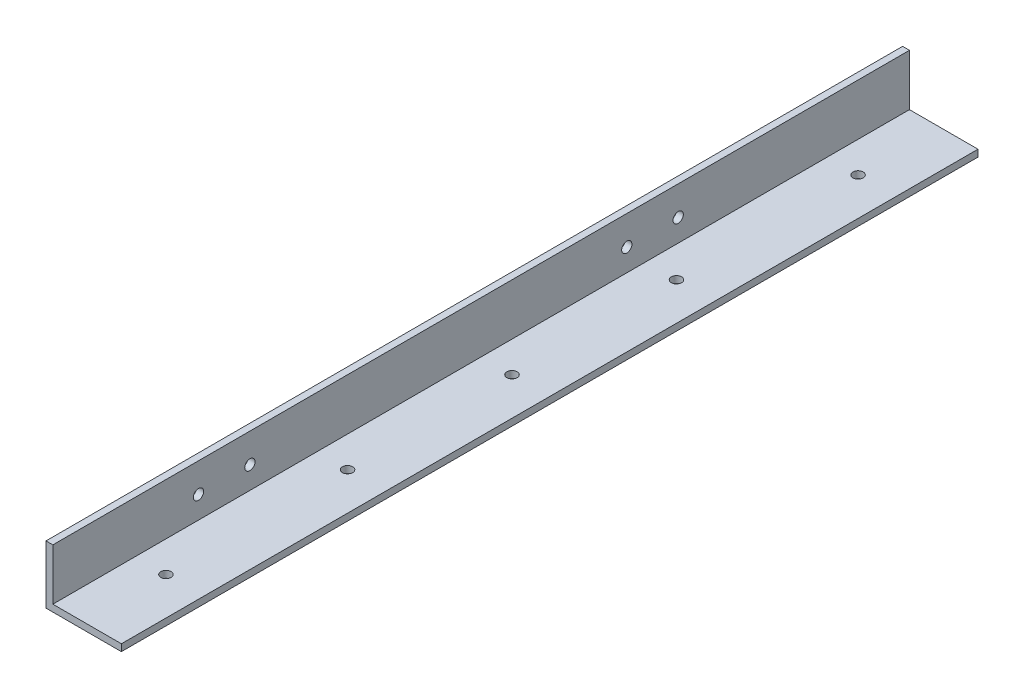
ISO-10303-21;
HEADER;
FILE_DESCRIPTION(('STEP AP214'),'2;1');
FILE_NAME('part.step','',(''),(''),'','','');
FILE_SCHEMA(('AUTOMOTIVE_DESIGN { 1 0 10303 214 1 1 1 1 }'));
ENDSEC;
DATA;
#1=APPLICATION_CONTEXT('core data for automotive mechanical design processes');
#2=APPLICATION_PROTOCOL_DEFINITION('international standard','automotive_design',2000,#1);
#3=PRODUCT_CONTEXT('',#1,'mechanical');
#4=PRODUCT('Part','Part','',(#3));
#5=PRODUCT_RELATED_PRODUCT_CATEGORY('part','',(#4));
#6=PRODUCT_DEFINITION_FORMATION('','',#4);
#7=PRODUCT_DEFINITION_CONTEXT('part definition',#1,'design');
#8=PRODUCT_DEFINITION('design','',#6,#7);
#9=PRODUCT_DEFINITION_SHAPE('','',#8);
#10=(LENGTH_UNIT() NAMED_UNIT(*) SI_UNIT(.MILLI.,.METRE.));
#11=(NAMED_UNIT(*) PLANE_ANGLE_UNIT() SI_UNIT($,.RADIAN.));
#12=(NAMED_UNIT(*) SI_UNIT($,.STERADIAN.) SOLID_ANGLE_UNIT());
#13=UNCERTAINTY_MEASURE_WITH_UNIT(LENGTH_MEASURE(1.E-05),#10,'distance_accuracy_value','');
#14=(GEOMETRIC_REPRESENTATION_CONTEXT(3) GLOBAL_UNCERTAINTY_ASSIGNED_CONTEXT((#13)) GLOBAL_UNIT_ASSIGNED_CONTEXT((#10,
#11,#12)) REPRESENTATION_CONTEXT('',''));
#15=CARTESIAN_POINT('',(0.,0.,0.));
#16=DIRECTION('',(0.,0.,1.));
#17=DIRECTION('',(1.,0.,0.));
#18=AXIS2_PLACEMENT_3D('',#15,#16,#17);
#19=CARTESIAN_POINT('',(0.,0.,-250.));
#20=DIRECTION('',(0.,-1.,0.));
#21=DIRECTION('',(0.,0.,-1.));
#22=AXIS2_PLACEMENT_3D('',#19,#20,#21);
#23=PLANE('',#22);
#24=CARTESIAN_POINT('',(11.,0.,-226.));
#25=DIRECTION('',(0.,-1.,0.));
#26=DIRECTION('',(0.,0.,-1.));
#27=AXIS2_PLACEMENT_3D('',#24,#25,#26);
#28=CIRCLE('',#27,1.5);
#29=CARTESIAN_POINT('',(11.,0.,-227.5));
#30=VERTEX_POINT('',#29);
#31=EDGE_CURVE('E131',#30,#30,#28,.T.);
#32=ORIENTED_EDGE('',*,*,#31,.F.);
#33=EDGE_LOOP('',(#32));
#34=FACE_BOUND('',#33,.T.);
#35=CARTESIAN_POINT('',(11.,0.,-77.));
#36=DIRECTION('',(0.,-1.,0.));
#37=DIRECTION('',(0.,0.,-1.));
#38=AXIS2_PLACEMENT_3D('',#35,#36,#37);
#39=CIRCLE('',#38,1.5);
#40=CARTESIAN_POINT('',(11.,0.,-78.5));
#41=VERTEX_POINT('',#40);
#42=EDGE_CURVE('E188',#41,#41,#39,.T.);
#43=ORIENTED_EDGE('',*,*,#42,.F.);
#44=EDGE_LOOP('',(#43));
#45=FACE_BOUND('',#44,.T.);
#46=CARTESIAN_POINT('',(11.,0.,-173.));
#47=DIRECTION('',(0.,-1.,0.));
#48=DIRECTION('',(0.,0.,-1.));
#49=AXIS2_PLACEMENT_3D('',#46,#47,#48);
#50=CIRCLE('',#49,1.5);
#51=CARTESIAN_POINT('',(11.,0.,-174.5));
#52=VERTEX_POINT('',#51);
#53=EDGE_CURVE('E185',#52,#52,#50,.T.);
#54=ORIENTED_EDGE('',*,*,#53,.F.);
#55=EDGE_LOOP('',(#54));
#56=FACE_BOUND('',#55,.T.);
#57=CARTESIAN_POINT('',(11.,0.,-125.));
#58=DIRECTION('',(0.,-1.,0.));
#59=DIRECTION('',(0.,0.,-1.));
#60=AXIS2_PLACEMENT_3D('',#57,#58,#59);
#61=CIRCLE('',#60,1.5);
#62=CARTESIAN_POINT('',(11.,0.,-126.5));
#63=VERTEX_POINT('',#62);
#64=EDGE_CURVE('E182',#63,#63,#61,.T.);
#65=ORIENTED_EDGE('',*,*,#64,.F.);
#66=EDGE_LOOP('',(#65));
#67=FACE_BOUND('',#66,.T.);
#68=CARTESIAN_POINT('',(11.,0.,-24.));
#69=DIRECTION('',(0.,-1.,0.));
#70=DIRECTION('',(0.,0.,-1.));
#71=AXIS2_PLACEMENT_3D('',#68,#69,#70);
#72=CIRCLE('',#71,1.5);
#73=CARTESIAN_POINT('',(11.,0.,-25.5));
#74=VERTEX_POINT('',#73);
#75=EDGE_CURVE('E179',#74,#74,#72,.T.);
#76=ORIENTED_EDGE('',*,*,#75,.F.);
#77=EDGE_LOOP('',(#76));
#78=FACE_BOUND('',#77,.T.);
#79=DIRECTION('',(1.,0.,0.));
#80=VECTOR('',#79,1.);
#81=CARTESIAN_POINT('',(0.,0.,0.));
#82=LINE('',#81,#80);
#83=CARTESIAN_POINT('',(0.,0.,0.));
#84=VERTEX_POINT('',#83);
#85=CARTESIAN_POINT('',(22.,0.,0.));
#86=VERTEX_POINT('',#85);
#87=EDGE_CURVE('E127',#84,#86,#82,.T.);
#88=ORIENTED_EDGE('',*,*,#87,.F.);
#89=DIRECTION('',(0.,0.,1.));
#90=VECTOR('',#89,1.);
#91=CARTESIAN_POINT('',(0.,0.,-250.));
#92=LINE('',#91,#90);
#93=CARTESIAN_POINT('',(0.,0.,-250.));
#94=VERTEX_POINT('',#93);
#95=EDGE_CURVE('E11',#94,#84,#92,.T.);
#96=ORIENTED_EDGE('',*,*,#95,.F.);
#97=DIRECTION('',(1.,0.,0.));
#98=VECTOR('',#97,1.);
#99=CARTESIAN_POINT('',(0.,0.,-250.));
#100=LINE('',#99,#98);
#101=CARTESIAN_POINT('',(22.,0.,-250.));
#102=VERTEX_POINT('',#101);
#103=EDGE_CURVE('E142',#94,#102,#100,.T.);
#104=ORIENTED_EDGE('',*,*,#103,.T.);
#105=DIRECTION('',(0.,0.,1.));
#106=VECTOR('',#105,1.);
#107=CARTESIAN_POINT('',(22.,0.,-250.));
#108=LINE('',#107,#106);
#109=EDGE_CURVE('E91',#102,#86,#108,.T.);
#110=ORIENTED_EDGE('',*,*,#109,.T.);
#111=EDGE_LOOP('',(#88,#96,#104,#110));
#112=FACE_BOUND('',#111,.T.);
#113=ADVANCED_FACE('F41',(#34,#45,#56,#67,#78,#112),#23,.T.);
#114=CARTESIAN_POINT('',(0.,0.,-250.));
#115=DIRECTION('',(-1.,0.,0.));
#116=DIRECTION('',(0.,0.,1.));
#117=AXIS2_PLACEMENT_3D('',#114,#115,#116);
#118=PLANE('',#117);
#119=CARTESIAN_POINT('',(0.,8.5,-182.5));
#120=DIRECTION('',(-1.,0.,0.));
#121=DIRECTION('',(0.,0.,1.));
#122=AXIS2_PLACEMENT_3D('',#119,#120,#121);
#123=CIRCLE('',#122,1.5);
#124=CARTESIAN_POINT('',(0.,8.5,-181.));
#125=VERTEX_POINT('',#124);
#126=EDGE_CURVE('E153',#125,#125,#123,.T.);
#127=ORIENTED_EDGE('',*,*,#126,.F.);
#128=EDGE_LOOP('',(#127));
#129=FACE_BOUND('',#128,.T.);
#130=CARTESIAN_POINT('',(0.,8.5,-57.5));
#131=DIRECTION('',(-1.,0.,0.));
#132=DIRECTION('',(0.,0.,1.));
#133=AXIS2_PLACEMENT_3D('',#130,#131,#132);
#134=CIRCLE('',#133,1.5);
#135=CARTESIAN_POINT('',(0.,8.5,-56.));
#136=VERTEX_POINT('',#135);
#137=EDGE_CURVE('E269',#136,#136,#134,.T.);
#138=ORIENTED_EDGE('',*,*,#137,.F.);
#139=EDGE_LOOP('',(#138));
#140=FACE_BOUND('',#139,.T.);
#141=CARTESIAN_POINT('',(0.,8.5,-42.5));
#142=DIRECTION('',(-1.,0.,0.));
#143=DIRECTION('',(0.,0.,1.));
#144=AXIS2_PLACEMENT_3D('',#141,#142,#143);
#145=CIRCLE('',#144,1.5);
#146=CARTESIAN_POINT('',(0.,8.5,-41.));
#147=VERTEX_POINT('',#146);
#148=EDGE_CURVE('E266',#147,#147,#145,.T.);
#149=ORIENTED_EDGE('',*,*,#148,.F.);
#150=EDGE_LOOP('',(#149));
#151=FACE_BOUND('',#150,.T.);
#152=CARTESIAN_POINT('',(0.,8.5,-167.5));
#153=DIRECTION('',(-1.,0.,0.));
#154=DIRECTION('',(0.,0.,1.));
#155=AXIS2_PLACEMENT_3D('',#152,#153,#154);
#156=CIRCLE('',#155,1.5);
#157=CARTESIAN_POINT('',(0.,8.5,-166.));
#158=VERTEX_POINT('',#157);
#159=EDGE_CURVE('E263',#158,#158,#156,.T.);
#160=ORIENTED_EDGE('',*,*,#159,.F.);
#161=EDGE_LOOP('',(#160));
#162=FACE_BOUND('',#161,.T.);
#163=DIRECTION('',(0.,-1.,0.));
#164=VECTOR('',#163,1.);
#165=CARTESIAN_POINT('',(0.,0.,0.));
#166=LINE('',#165,#164);
#167=CARTESIAN_POINT('',(0.,17.,0.));
#168=VERTEX_POINT('',#167);
#169=EDGE_CURVE('E140',#168,#84,#166,.T.);
#170=ORIENTED_EDGE('',*,*,#169,.F.);
#171=DIRECTION('',(0.,0.,1.));
#172=VECTOR('',#171,1.);
#173=CARTESIAN_POINT('',(0.,17.,-250.));
#174=LINE('',#173,#172);
#175=CARTESIAN_POINT('',(0.,17.,-250.));
#176=VERTEX_POINT('',#175);
#177=EDGE_CURVE('E50',#176,#168,#174,.T.);
#178=ORIENTED_EDGE('',*,*,#177,.F.);
#179=DIRECTION('',(0.,-1.,0.));
#180=VECTOR('',#179,1.);
#181=CARTESIAN_POINT('',(0.,0.,-250.));
#182=LINE('',#181,#180);
#183=EDGE_CURVE('E117',#176,#94,#182,.T.);
#184=ORIENTED_EDGE('',*,*,#183,.T.);
#185=ORIENTED_EDGE('',*,*,#95,.T.);
#186=EDGE_LOOP('',(#170,#178,#184,#185));
#187=FACE_BOUND('',#186,.T.);
#188=ADVANCED_FACE('F197',(#129,#140,#151,#162,#187),#118,.T.);
#189=CARTESIAN_POINT('',(0.,17.,-250.));
#190=DIRECTION('',(0.,1.,0.));
#191=DIRECTION('',(0.,0.,1.));
#192=AXIS2_PLACEMENT_3D('',#189,#190,#191);
#193=PLANE('',#192);
#194=DIRECTION('',(-1.,0.,0.));
#195=VECTOR('',#194,1.);
#196=CARTESIAN_POINT('',(0.,17.,0.));
#197=LINE('',#196,#195);
#198=CARTESIAN_POINT('',(2.,17.,0.));
#199=VERTEX_POINT('',#198);
#200=EDGE_CURVE('E104',#199,#168,#197,.T.);
#201=ORIENTED_EDGE('',*,*,#200,.F.);
#202=DIRECTION('',(0.,0.,1.));
#203=VECTOR('',#202,1.);
#204=CARTESIAN_POINT('',(2.,17.,-250.));
#205=LINE('',#204,#203);
#206=CARTESIAN_POINT('',(2.,17.,-250.));
#207=VERTEX_POINT('',#206);
#208=EDGE_CURVE('E99',#207,#199,#205,.T.);
#209=ORIENTED_EDGE('',*,*,#208,.F.);
#210=DIRECTION('',(-1.,0.,0.));
#211=VECTOR('',#210,1.);
#212=CARTESIAN_POINT('',(0.,17.,-250.));
#213=LINE('',#212,#211);
#214=EDGE_CURVE('E102',#207,#176,#213,.T.);
#215=ORIENTED_EDGE('',*,*,#214,.T.);
#216=ORIENTED_EDGE('',*,*,#177,.T.);
#217=EDGE_LOOP('',(#201,#209,#215,#216));
#218=FACE_BOUND('',#217,.T.);
#219=ADVANCED_FACE('F101',(#218),#193,.T.);
#220=CARTESIAN_POINT('',(2.,17.,-250.));
#221=DIRECTION('',(1.,0.,0.));
#222=DIRECTION('',(0.,1.,0.));
#223=AXIS2_PLACEMENT_3D('',#220,#221,#222);
#224=PLANE('',#223);
#225=CARTESIAN_POINT('',(2.,8.5,-182.5));
#226=DIRECTION('',(1.,0.,0.));
#227=DIRECTION('',(0.,1.,0.));
#228=AXIS2_PLACEMENT_3D('',#225,#226,#227);
#229=CIRCLE('',#228,1.5);
#230=CARTESIAN_POINT('',(2.,10.,-182.5));
#231=VERTEX_POINT('',#230);
#232=EDGE_CURVE('E44',#231,#231,#229,.T.);
#233=ORIENTED_EDGE('',*,*,#232,.F.);
#234=EDGE_LOOP('',(#233));
#235=FACE_BOUND('',#234,.T.);
#236=CARTESIAN_POINT('',(2.,8.5,-57.5));
#237=DIRECTION('',(1.,0.,0.));
#238=DIRECTION('',(0.,1.,0.));
#239=AXIS2_PLACEMENT_3D('',#236,#237,#238);
#240=CIRCLE('',#239,1.5);
#241=CARTESIAN_POINT('',(2.,9.99999999999999,-57.5));
#242=VERTEX_POINT('',#241);
#243=EDGE_CURVE('E155',#242,#242,#240,.T.);
#244=ORIENTED_EDGE('',*,*,#243,.F.);
#245=EDGE_LOOP('',(#244));
#246=FACE_BOUND('',#245,.T.);
#247=CARTESIAN_POINT('',(2.,8.5,-42.5));
#248=DIRECTION('',(1.,0.,0.));
#249=DIRECTION('',(0.,1.,0.));
#250=AXIS2_PLACEMENT_3D('',#247,#248,#249);
#251=CIRCLE('',#250,1.5);
#252=CARTESIAN_POINT('',(2.,10.,-42.5));
#253=VERTEX_POINT('',#252);
#254=EDGE_CURVE('E152',#253,#253,#251,.T.);
#255=ORIENTED_EDGE('',*,*,#254,.F.);
#256=EDGE_LOOP('',(#255));
#257=FACE_BOUND('',#256,.T.);
#258=CARTESIAN_POINT('',(2.,8.5,-167.5));
#259=DIRECTION('',(1.,0.,0.));
#260=DIRECTION('',(0.,1.,0.));
#261=AXIS2_PLACEMENT_3D('',#258,#259,#260);
#262=CIRCLE('',#261,1.5);
#263=CARTESIAN_POINT('',(2.,10.,-167.5));
#264=VERTEX_POINT('',#263);
#265=EDGE_CURVE('E149',#264,#264,#262,.T.);
#266=ORIENTED_EDGE('',*,*,#265,.F.);
#267=EDGE_LOOP('',(#266));
#268=FACE_BOUND('',#267,.T.);
#269=DIRECTION('',(0.,1.,0.));
#270=VECTOR('',#269,1.);
#271=CARTESIAN_POINT('',(2.,17.,0.));
#272=LINE('',#271,#270);
#273=CARTESIAN_POINT('',(2.,2.,0.));
#274=VERTEX_POINT('',#273);
#275=EDGE_CURVE('E137',#274,#199,#272,.T.);
#276=ORIENTED_EDGE('',*,*,#275,.F.);
#277=DIRECTION('',(0.,0.,1.));
#278=VECTOR('',#277,1.);
#279=CARTESIAN_POINT('',(2.,2.,-250.));
#280=LINE('',#279,#278);
#281=CARTESIAN_POINT('',(2.,2.,-250.));
#282=VERTEX_POINT('',#281);
#283=EDGE_CURVE('E109',#282,#274,#280,.T.);
#284=ORIENTED_EDGE('',*,*,#283,.F.);
#285=DIRECTION('',(0.,1.,0.));
#286=VECTOR('',#285,1.);
#287=CARTESIAN_POINT('',(2.,17.,-250.));
#288=LINE('',#287,#286);
#289=EDGE_CURVE('E115',#282,#207,#288,.T.);
#290=ORIENTED_EDGE('',*,*,#289,.T.);
#291=ORIENTED_EDGE('',*,*,#208,.T.);
#292=EDGE_LOOP('',(#276,#284,#290,#291));
#293=FACE_BOUND('',#292,.T.);
#294=ADVANCED_FACE('F119',(#235,#246,#257,#268,#293),#224,.T.);
#295=CARTESIAN_POINT('',(2.,2.,-250.));
#296=DIRECTION('',(0.,1.,0.));
#297=DIRECTION('',(0.,0.,1.));
#298=AXIS2_PLACEMENT_3D('',#295,#296,#297);
#299=PLANE('',#298);
#300=CARTESIAN_POINT('',(11.,2.,-226.));
#301=DIRECTION('',(0.,1.,0.));
#302=DIRECTION('',(0.,0.,1.));
#303=AXIS2_PLACEMENT_3D('',#300,#301,#302);
#304=CIRCLE('',#303,1.5);
#305=CARTESIAN_POINT('',(11.,2.,-224.5));
#306=VERTEX_POINT('',#305);
#307=EDGE_CURVE('E176',#306,#306,#304,.T.);
#308=ORIENTED_EDGE('',*,*,#307,.F.);
#309=EDGE_LOOP('',(#308));
#310=FACE_BOUND('',#309,.T.);
#311=CARTESIAN_POINT('',(11.,2.,-77.));
#312=DIRECTION('',(0.,1.,0.));
#313=DIRECTION('',(0.,0.,1.));
#314=AXIS2_PLACEMENT_3D('',#311,#312,#313);
#315=CIRCLE('',#314,1.5);
#316=CARTESIAN_POINT('',(11.,2.,-75.5));
#317=VERTEX_POINT('',#316);
#318=EDGE_CURVE('E160',#317,#317,#315,.T.);
#319=ORIENTED_EDGE('',*,*,#318,.F.);
#320=EDGE_LOOP('',(#319));
#321=FACE_BOUND('',#320,.T.);
#322=CARTESIAN_POINT('',(11.,2.,-173.));
#323=DIRECTION('',(0.,1.,0.));
#324=DIRECTION('',(0.,0.,1.));
#325=AXIS2_PLACEMENT_3D('',#322,#323,#324);
#326=CIRCLE('',#325,1.5);
#327=CARTESIAN_POINT('',(11.,2.,-171.5));
#328=VERTEX_POINT('',#327);
#329=EDGE_CURVE('E164',#328,#328,#326,.T.);
#330=ORIENTED_EDGE('',*,*,#329,.F.);
#331=EDGE_LOOP('',(#330));
#332=FACE_BOUND('',#331,.T.);
#333=CARTESIAN_POINT('',(11.,2.,-125.));
#334=DIRECTION('',(0.,1.,0.));
#335=DIRECTION('',(0.,0.,1.));
#336=AXIS2_PLACEMENT_3D('',#333,#334,#335);
#337=CIRCLE('',#336,1.5);
#338=CARTESIAN_POINT('',(11.,2.,-123.5));
#339=VERTEX_POINT('',#338);
#340=EDGE_CURVE('E169',#339,#339,#337,.T.);
#341=ORIENTED_EDGE('',*,*,#340,.F.);
#342=EDGE_LOOP('',(#341));
#343=FACE_BOUND('',#342,.T.);
#344=CARTESIAN_POINT('',(11.,2.,-24.));
#345=DIRECTION('',(0.,1.,0.));
#346=DIRECTION('',(0.,0.,-1.));
#347=AXIS2_PLACEMENT_3D('',#344,#345,#346);
#348=CIRCLE('',#347,1.5);
#349=CARTESIAN_POINT('',(11.,2.,-25.5));
#350=VERTEX_POINT('',#349);
#351=EDGE_CURVE('E173',#350,#350,#348,.T.);
#352=ORIENTED_EDGE('',*,*,#351,.F.);
#353=EDGE_LOOP('',(#352));
#354=FACE_BOUND('',#353,.T.);
#355=DIRECTION('',(-1.,0.,0.));
#356=VECTOR('',#355,1.);
#357=CARTESIAN_POINT('',(2.,2.,0.));
#358=LINE('',#357,#356);
#359=CARTESIAN_POINT('',(22.,2.,0.));
#360=VERTEX_POINT('',#359);
#361=EDGE_CURVE('E134',#360,#274,#358,.T.);
#362=ORIENTED_EDGE('',*,*,#361,.F.);
#363=DIRECTION('',(0.,0.,1.));
#364=VECTOR('',#363,1.);
#365=CARTESIAN_POINT('',(22.,2.,-250.));
#366=LINE('',#365,#364);
#367=CARTESIAN_POINT('',(22.,2.,-250.));
#368=VERTEX_POINT('',#367);
#369=EDGE_CURVE('E146',#368,#360,#366,.T.);
#370=ORIENTED_EDGE('',*,*,#369,.F.);
#371=DIRECTION('',(-1.,0.,0.));
#372=VECTOR('',#371,1.);
#373=CARTESIAN_POINT('',(2.,2.,-250.));
#374=LINE('',#373,#372);
#375=EDGE_CURVE('E120',#368,#282,#374,.T.);
#376=ORIENTED_EDGE('',*,*,#375,.T.);
#377=ORIENTED_EDGE('',*,*,#283,.T.);
#378=EDGE_LOOP('',(#362,#370,#376,#377));
#379=FACE_BOUND('',#378,.T.);
#380=ADVANCED_FACE('F215',(#310,#321,#332,#343,#354,#379),#299,.T.);
#381=CARTESIAN_POINT('',(22.,2.,-250.));
#382=DIRECTION('',(1.,0.,0.));
#383=DIRECTION('',(0.,0.,-1.));
#384=AXIS2_PLACEMENT_3D('',#381,#382,#383);
#385=PLANE('',#384);
#386=DIRECTION('',(0.,1.,0.));
#387=VECTOR('',#386,1.);
#388=CARTESIAN_POINT('',(22.,2.,0.));
#389=LINE('',#388,#387);
#390=EDGE_CURVE('E130',#86,#360,#389,.T.);
#391=ORIENTED_EDGE('',*,*,#390,.F.);
#392=ORIENTED_EDGE('',*,*,#109,.F.);
#393=DIRECTION('',(0.,1.,0.));
#394=VECTOR('',#393,1.);
#395=CARTESIAN_POINT('',(22.,2.,-250.));
#396=LINE('',#395,#394);
#397=EDGE_CURVE('E122',#102,#368,#396,.T.);
#398=ORIENTED_EDGE('',*,*,#397,.T.);
#399=ORIENTED_EDGE('',*,*,#369,.T.);
#400=EDGE_LOOP('',(#391,#392,#398,#399));
#401=FACE_BOUND('',#400,.T.);
#402=ADVANCED_FACE('F193',(#401),#385,.T.);
#403=CARTESIAN_POINT('',(0.,0.,-250.));
#404=DIRECTION('',(0.,0.,-1.));
#405=DIRECTION('',(-1.,0.,0.));
#406=AXIS2_PLACEMENT_3D('',#403,#404,#405);
#407=PLANE('',#406);
#408=ORIENTED_EDGE('',*,*,#103,.F.);
#409=ORIENTED_EDGE('',*,*,#183,.F.);
#410=ORIENTED_EDGE('',*,*,#214,.F.);
#411=ORIENTED_EDGE('',*,*,#289,.F.);
#412=ORIENTED_EDGE('',*,*,#375,.F.);
#413=ORIENTED_EDGE('',*,*,#397,.F.);
#414=EDGE_LOOP('',(#408,#409,#410,#411,#412,#413));
#415=FACE_BOUND('',#414,.T.);
#416=ADVANCED_FACE('F113',(#415),#407,.T.);
#417=CARTESIAN_POINT('',(0.,0.,0.));
#418=DIRECTION('',(0.,0.,-1.));
#419=DIRECTION('',(-1.,0.,0.));
#420=AXIS2_PLACEMENT_3D('',#417,#418,#419);
#421=PLANE('',#420);
#422=ORIENTED_EDGE('',*,*,#87,.T.);
#423=ORIENTED_EDGE('',*,*,#390,.T.);
#424=ORIENTED_EDGE('',*,*,#361,.T.);
#425=ORIENTED_EDGE('',*,*,#275,.T.);
#426=ORIENTED_EDGE('',*,*,#200,.T.);
#427=ORIENTED_EDGE('',*,*,#169,.T.);
#428=EDGE_LOOP('',(#422,#423,#424,#425,#426,#427));
#429=FACE_BOUND('',#428,.T.);
#430=ADVANCED_FACE('F196',(#429),#421,.F.);
#431=CARTESIAN_POINT('',(11.,-18.,-24.));
#432=DIRECTION('',(0.,1.,0.));
#433=DIRECTION('',(0.,0.,1.));
#434=AXIS2_PLACEMENT_3D('',#431,#432,#433);
#435=CYLINDRICAL_SURFACE('',#434,1.5);
#436=ORIENTED_EDGE('',*,*,#75,.T.);
#437=EDGE_LOOP('',(#436));
#438=FACE_BOUND('',#437,.T.);
#439=ORIENTED_EDGE('',*,*,#351,.T.);
#440=EDGE_LOOP('',(#439));
#441=FACE_BOUND('',#440,.T.);
#442=ADVANCED_FACE('F226',(#438,#441),#435,.F.);
#443=CARTESIAN_POINT('',(11.,-18.,-125.));
#444=DIRECTION('',(0.,1.,0.));
#445=DIRECTION('',(0.,0.,1.));
#446=AXIS2_PLACEMENT_3D('',#443,#444,#445);
#447=CYLINDRICAL_SURFACE('',#446,1.5);
#448=ORIENTED_EDGE('',*,*,#64,.T.);
#449=EDGE_LOOP('',(#448));
#450=FACE_BOUND('',#449,.T.);
#451=ORIENTED_EDGE('',*,*,#340,.T.);
#452=EDGE_LOOP('',(#451));
#453=FACE_BOUND('',#452,.T.);
#454=ADVANCED_FACE('F228',(#450,#453),#447,.F.);
#455=CARTESIAN_POINT('',(11.,-18.,-173.));
#456=DIRECTION('',(0.,1.,0.));
#457=DIRECTION('',(0.,0.,1.));
#458=AXIS2_PLACEMENT_3D('',#455,#456,#457);
#459=CYLINDRICAL_SURFACE('',#458,1.5);
#460=ORIENTED_EDGE('',*,*,#53,.T.);
#461=EDGE_LOOP('',(#460));
#462=FACE_BOUND('',#461,.T.);
#463=ORIENTED_EDGE('',*,*,#329,.T.);
#464=EDGE_LOOP('',(#463));
#465=FACE_BOUND('',#464,.T.);
#466=ADVANCED_FACE('F231',(#462,#465),#459,.F.);
#467=CARTESIAN_POINT('',(11.,-18.,-77.));
#468=DIRECTION('',(0.,1.,0.));
#469=DIRECTION('',(0.,0.,1.));
#470=AXIS2_PLACEMENT_3D('',#467,#468,#469);
#471=CYLINDRICAL_SURFACE('',#470,1.5);
#472=ORIENTED_EDGE('',*,*,#42,.T.);
#473=EDGE_LOOP('',(#472));
#474=FACE_BOUND('',#473,.T.);
#475=ORIENTED_EDGE('',*,*,#318,.T.);
#476=EDGE_LOOP('',(#475));
#477=FACE_BOUND('',#476,.T.);
#478=ADVANCED_FACE('F236',(#474,#477),#471,.F.);
#479=CARTESIAN_POINT('',(11.,-18.,-226.));
#480=DIRECTION('',(0.,1.,0.));
#481=DIRECTION('',(0.,0.,1.));
#482=AXIS2_PLACEMENT_3D('',#479,#480,#481);
#483=CYLINDRICAL_SURFACE('',#482,1.5);
#484=ORIENTED_EDGE('',*,*,#31,.T.);
#485=EDGE_LOOP('',(#484));
#486=FACE_BOUND('',#485,.T.);
#487=ORIENTED_EDGE('',*,*,#307,.T.);
#488=EDGE_LOOP('',(#487));
#489=FACE_BOUND('',#488,.T.);
#490=ADVANCED_FACE('F239',(#486,#489),#483,.F.);
#491=CARTESIAN_POINT('',(10.,8.5,-167.5));
#492=DIRECTION('',(-1.,0.,0.));
#493=DIRECTION('',(0.,0.,1.));
#494=AXIS2_PLACEMENT_3D('',#491,#492,#493);
#495=CYLINDRICAL_SURFACE('',#494,1.5);
#496=ORIENTED_EDGE('',*,*,#265,.T.);
#497=EDGE_LOOP('',(#496));
#498=FACE_BOUND('',#497,.T.);
#499=ORIENTED_EDGE('',*,*,#159,.T.);
#500=EDGE_LOOP('',(#499));
#501=FACE_BOUND('',#500,.T.);
#502=ADVANCED_FACE('F245',(#498,#501),#495,.F.);
#503=CARTESIAN_POINT('',(10.,8.5,-42.5));
#504=DIRECTION('',(-1.,0.,0.));
#505=DIRECTION('',(0.,0.,1.));
#506=AXIS2_PLACEMENT_3D('',#503,#504,#505);
#507=CYLINDRICAL_SURFACE('',#506,1.5);
#508=ORIENTED_EDGE('',*,*,#254,.T.);
#509=EDGE_LOOP('',(#508));
#510=FACE_BOUND('',#509,.T.);
#511=ORIENTED_EDGE('',*,*,#148,.T.);
#512=EDGE_LOOP('',(#511));
#513=FACE_BOUND('',#512,.T.);
#514=ADVANCED_FACE('F247',(#510,#513),#507,.F.);
#515=CARTESIAN_POINT('',(10.,8.5,-57.5));
#516=DIRECTION('',(-1.,0.,0.));
#517=DIRECTION('',(0.,0.,1.));
#518=AXIS2_PLACEMENT_3D('',#515,#516,#517);
#519=CYLINDRICAL_SURFACE('',#518,1.5);
#520=ORIENTED_EDGE('',*,*,#243,.T.);
#521=EDGE_LOOP('',(#520));
#522=FACE_BOUND('',#521,.T.);
#523=ORIENTED_EDGE('',*,*,#137,.T.);
#524=EDGE_LOOP('',(#523));
#525=FACE_BOUND('',#524,.T.);
#526=ADVANCED_FACE('F250',(#522,#525),#519,.F.);
#527=CARTESIAN_POINT('',(10.,8.5,-182.5));
#528=DIRECTION('',(-1.,0.,0.));
#529=DIRECTION('',(0.,0.,1.));
#530=AXIS2_PLACEMENT_3D('',#527,#528,#529);
#531=CYLINDRICAL_SURFACE('',#530,1.5);
#532=ORIENTED_EDGE('',*,*,#232,.T.);
#533=EDGE_LOOP('',(#532));
#534=FACE_BOUND('',#533,.T.);
#535=ORIENTED_EDGE('',*,*,#126,.T.);
#536=EDGE_LOOP('',(#535));
#537=FACE_BOUND('',#536,.T.);
#538=ADVANCED_FACE('F257',(#534,#537),#531,.F.);
#539=CLOSED_SHELL('',(#113,#188,#219,#294,#380,#402,#416,#430,#442,#454,#466,#478,#490,#502,
#514,#526,#538));
#540=MANIFOLD_SOLID_BREP('B2',#539);
#541=ADVANCED_BREP_SHAPE_REPRESENTATION('',(#18,#540),#14);
#542=SHAPE_DEFINITION_REPRESENTATION(#9,#541);
ENDSEC;
END-ISO-10303-21;
